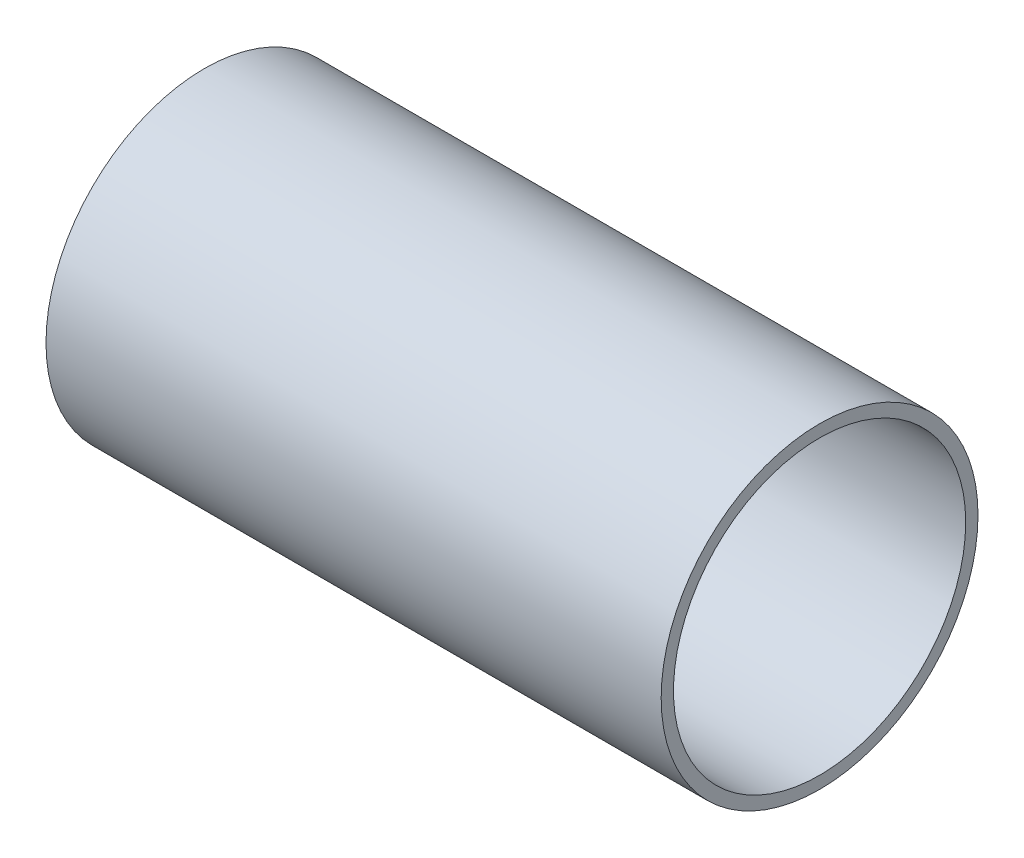
ISO-10303-21;
HEADER;
FILE_DESCRIPTION(('STEP AP214'),'2;1');
FILE_NAME('part.step','',(''),(''),'','','');
FILE_SCHEMA(('AUTOMOTIVE_DESIGN { 1 0 10303 214 1 1 1 1 }'));
ENDSEC;
DATA;
#1=APPLICATION_CONTEXT('core data for automotive mechanical design processes');
#2=APPLICATION_PROTOCOL_DEFINITION('international standard','automotive_design',2000,#1);
#3=PRODUCT_CONTEXT('',#1,'mechanical');
#4=PRODUCT('Part','Part','',(#3));
#5=PRODUCT_RELATED_PRODUCT_CATEGORY('part','',(#4));
#6=PRODUCT_DEFINITION_FORMATION('','',#4);
#7=PRODUCT_DEFINITION_CONTEXT('part definition',#1,'design');
#8=PRODUCT_DEFINITION('design','',#6,#7);
#9=PRODUCT_DEFINITION_SHAPE('','',#8);
#10=(LENGTH_UNIT() NAMED_UNIT(*) SI_UNIT(.MILLI.,.METRE.));
#11=(NAMED_UNIT(*) PLANE_ANGLE_UNIT() SI_UNIT($,.RADIAN.));
#12=(NAMED_UNIT(*) SI_UNIT($,.STERADIAN.) SOLID_ANGLE_UNIT());
#13=UNCERTAINTY_MEASURE_WITH_UNIT(LENGTH_MEASURE(1.E-05),#10,'distance_accuracy_value','');
#14=(GEOMETRIC_REPRESENTATION_CONTEXT(3) GLOBAL_UNCERTAINTY_ASSIGNED_CONTEXT((#13)) GLOBAL_UNIT_ASSIGNED_CONTEXT((#10,
#11,#12)) REPRESENTATION_CONTEXT('',''));
#15=CARTESIAN_POINT('',(0.,0.,0.));
#16=DIRECTION('',(0.,0.,1.));
#17=DIRECTION('',(1.,0.,0.));
#18=AXIS2_PLACEMENT_3D('',#15,#16,#17);
#19=CARTESIAN_POINT('',(200.,0.,0.));
#20=DIRECTION('',(1.,0.,0.));
#21=DIRECTION('',(0.,0.,-1.));
#22=AXIS2_PLACEMENT_3D('',#19,#20,#21);
#23=PLANE('',#22);
#24=CARTESIAN_POINT('',(200.,0.,0.));
#25=DIRECTION('',(1.,0.,0.));
#26=DIRECTION('',(0.,0.,-1.));
#27=AXIS2_PLACEMENT_3D('',#24,#25,#26);
#28=CIRCLE('',#27,51.5);
#29=CARTESIAN_POINT('',(200.,0.,-51.5));
#30=VERTEX_POINT('',#29);
#31=EDGE_CURVE('E10',#30,#30,#28,.T.);
#32=ORIENTED_EDGE('',*,*,#31,.T.);
#33=EDGE_LOOP('',(#32));
#34=FACE_BOUND('',#33,.T.);
#35=CARTESIAN_POINT('',(200.,0.,0.));
#36=DIRECTION('',(1.,0.,0.));
#37=DIRECTION('',(0.,0.,-1.));
#38=AXIS2_PLACEMENT_3D('',#35,#36,#37);
#39=CIRCLE('',#38,47.5);
#40=CARTESIAN_POINT('',(200.,0.,-47.5));
#41=VERTEX_POINT('',#40);
#42=EDGE_CURVE('E51',#41,#41,#39,.T.);
#43=ORIENTED_EDGE('',*,*,#42,.F.);
#44=EDGE_LOOP('',(#43));
#45=FACE_BOUND('',#44,.T.);
#46=ADVANCED_FACE('F40',(#34,#45),#23,.T.);
#47=CARTESIAN_POINT('',(0.,0.,0.));
#48=DIRECTION('',(1.,0.,0.));
#49=DIRECTION('',(0.,0.,-1.));
#50=AXIS2_PLACEMENT_3D('',#47,#48,#49);
#51=PLANE('',#50);
#52=CARTESIAN_POINT('',(0.,0.,0.));
#53=DIRECTION('',(1.,0.,0.));
#54=DIRECTION('',(0.,0.,-1.));
#55=AXIS2_PLACEMENT_3D('',#52,#53,#54);
#56=CIRCLE('',#55,51.5);
#57=CARTESIAN_POINT('',(0.,0.,-51.5));
#58=VERTEX_POINT('',#57);
#59=EDGE_CURVE('E44',#58,#58,#56,.T.);
#60=ORIENTED_EDGE('',*,*,#59,.F.);
#61=EDGE_LOOP('',(#60));
#62=FACE_BOUND('',#61,.T.);
#63=CARTESIAN_POINT('',(0.,0.,0.));
#64=DIRECTION('',(1.,0.,0.));
#65=DIRECTION('',(0.,0.,-1.));
#66=AXIS2_PLACEMENT_3D('',#63,#64,#65);
#67=CIRCLE('',#66,47.5);
#68=CARTESIAN_POINT('',(0.,0.,-47.5));
#69=VERTEX_POINT('',#68);
#70=EDGE_CURVE('E53',#69,#69,#67,.T.);
#71=ORIENTED_EDGE('',*,*,#70,.T.);
#72=EDGE_LOOP('',(#71));
#73=FACE_BOUND('',#72,.T.);
#74=ADVANCED_FACE('F63',(#62,#73),#51,.F.);
#75=CARTESIAN_POINT('',(200.,0.,0.));
#76=DIRECTION('',(-1.,0.,0.));
#77=DIRECTION('',(0.,0.,1.));
#78=AXIS2_PLACEMENT_3D('',#75,#76,#77);
#79=CYLINDRICAL_SURFACE('',#78,51.5);
#80=ORIENTED_EDGE('',*,*,#31,.F.);
#81=EDGE_LOOP('',(#80));
#82=FACE_BOUND('',#81,.T.);
#83=ORIENTED_EDGE('',*,*,#59,.T.);
#84=EDGE_LOOP('',(#83));
#85=FACE_BOUND('',#84,.T.);
#86=ADVANCED_FACE('F42',(#82,#85),#79,.T.);
#87=CARTESIAN_POINT('',(200.,0.,0.));
#88=DIRECTION('',(-1.,0.,0.));
#89=DIRECTION('',(0.,0.,1.));
#90=AXIS2_PLACEMENT_3D('',#87,#88,#89);
#91=CYLINDRICAL_SURFACE('',#90,47.5);
#92=ORIENTED_EDGE('',*,*,#42,.T.);
#93=EDGE_LOOP('',(#92));
#94=FACE_BOUND('',#93,.T.);
#95=ORIENTED_EDGE('',*,*,#70,.F.);
#96=EDGE_LOOP('',(#95));
#97=FACE_BOUND('',#96,.T.);
#98=ADVANCED_FACE('F59',(#94,#97),#91,.F.);
#99=CLOSED_SHELL('',(#46,#74,#86,#98));
#100=MANIFOLD_SOLID_BREP('B2',#99);
#101=ADVANCED_BREP_SHAPE_REPRESENTATION('',(#18,#100),#14);
#102=SHAPE_DEFINITION_REPRESENTATION(#9,#101);
ENDSEC;
END-ISO-10303-21;
